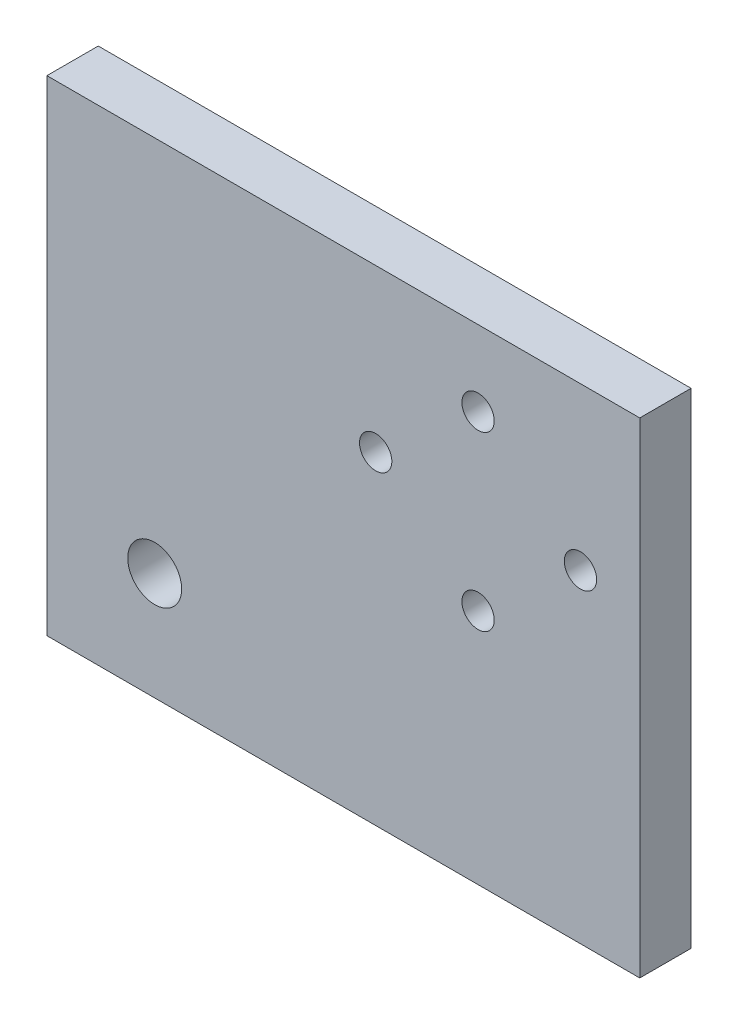
ISO-10303-21;
HEADER;
FILE_DESCRIPTION(('STEP AP214'),'2;1');
FILE_NAME('part.step','',(''),(''),'','','');
FILE_SCHEMA(('AUTOMOTIVE_DESIGN { 1 0 10303 214 1 1 1 1 }'));
ENDSEC;
DATA;
#1=APPLICATION_CONTEXT('core data for automotive mechanical design processes');
#2=APPLICATION_PROTOCOL_DEFINITION('international standard','automotive_design',2000,#1);
#3=PRODUCT_CONTEXT('',#1,'mechanical');
#4=PRODUCT('Part','Part','',(#3));
#5=PRODUCT_RELATED_PRODUCT_CATEGORY('part','',(#4));
#6=PRODUCT_DEFINITION_FORMATION('','',#4);
#7=PRODUCT_DEFINITION_CONTEXT('part definition',#1,'design');
#8=PRODUCT_DEFINITION('design','',#6,#7);
#9=PRODUCT_DEFINITION_SHAPE('','',#8);
#10=(LENGTH_UNIT() NAMED_UNIT(*) SI_UNIT(.MILLI.,.METRE.));
#11=(NAMED_UNIT(*) PLANE_ANGLE_UNIT() SI_UNIT($,.RADIAN.));
#12=(NAMED_UNIT(*) SI_UNIT($,.STERADIAN.) SOLID_ANGLE_UNIT());
#13=UNCERTAINTY_MEASURE_WITH_UNIT(LENGTH_MEASURE(1.E-05),#10,'distance_accuracy_value','');
#14=(GEOMETRIC_REPRESENTATION_CONTEXT(3) GLOBAL_UNCERTAINTY_ASSIGNED_CONTEXT((#13)) GLOBAL_UNIT_ASSIGNED_CONTEXT((#10,
#11,#12)) REPRESENTATION_CONTEXT('',''));
#15=CARTESIAN_POINT('',(0.,0.,0.));
#16=DIRECTION('',(0.,0.,1.));
#17=DIRECTION('',(1.,0.,0.));
#18=AXIS2_PLACEMENT_3D('',#15,#16,#17);
#19=CARTESIAN_POINT('',(0.,0.,4.7625));
#20=DIRECTION('',(0.,0.,-1.));
#21=DIRECTION('',(-1.,0.,0.));
#22=AXIS2_PLACEMENT_3D('',#19,#20,#21);
#23=PLANE('',#22);
#24=CARTESIAN_POINT('',(40.,38.,4.7625));
#25=DIRECTION('',(0.,0.,1.));
#26=DIRECTION('',(1.,0.,0.));
#27=AXIS2_PLACEMENT_3D('',#24,#25,#26);
#28=CIRCLE('',#27,1.5);
#29=CARTESIAN_POINT('',(38.5,38.,4.7625));
#30=VERTEX_POINT('',#29);
#31=EDGE_CURVE('E127',#30,#30,#28,.T.);
#32=ORIENTED_EDGE('',*,*,#31,.F.);
#33=EDGE_LOOP('',(#32));
#34=FACE_BOUND('',#33,.T.);
#35=CARTESIAN_POINT('',(30.5,30.,4.7625));
#36=DIRECTION('',(0.,0.,1.));
#37=DIRECTION('',(1.,0.,0.));
#38=AXIS2_PLACEMENT_3D('',#35,#36,#37);
#39=CIRCLE('',#38,1.50000000000001);
#40=CARTESIAN_POINT('',(29.,30.,4.7625));
#41=VERTEX_POINT('',#40);
#42=EDGE_CURVE('E115',#41,#41,#39,.T.);
#43=ORIENTED_EDGE('',*,*,#42,.F.);
#44=EDGE_LOOP('',(#43));
#45=FACE_BOUND('',#44,.T.);
#46=DIRECTION('',(0.,-1.,0.));
#47=VECTOR('',#46,1.);
#48=CARTESIAN_POINT('',(0.,0.,4.7625));
#49=LINE('',#48,#47);
#50=CARTESIAN_POINT('',(0.,45.,4.7625));
#51=VERTEX_POINT('',#50);
#52=CARTESIAN_POINT('',(0.,0.,4.7625));
#53=VERTEX_POINT('',#52);
#54=EDGE_CURVE('E85',#51,#53,#49,.T.);
#55=ORIENTED_EDGE('',*,*,#54,.T.);
#56=DIRECTION('',(1.,0.,0.));
#57=VECTOR('',#56,1.);
#58=CARTESIAN_POINT('',(0.,0.,4.7625));
#59=LINE('',#58,#57);
#60=CARTESIAN_POINT('',(55.,0.,4.7625));
#61=VERTEX_POINT('',#60);
#62=EDGE_CURVE('E80',#53,#61,#59,.T.);
#63=ORIENTED_EDGE('',*,*,#62,.T.);
#64=DIRECTION('',(0.,1.,0.));
#65=VECTOR('',#64,1.);
#66=CARTESIAN_POINT('',(55.,0.,4.7625));
#67=LINE('',#66,#65);
#68=CARTESIAN_POINT('',(55.,45.,4.7625));
#69=VERTEX_POINT('',#68);
#70=EDGE_CURVE('E83',#61,#69,#67,.T.);
#71=ORIENTED_EDGE('',*,*,#70,.T.);
#72=DIRECTION('',(-1.,0.,0.));
#73=VECTOR('',#72,1.);
#74=CARTESIAN_POINT('',(0.,45.,4.7625));
#75=LINE('',#74,#73);
#76=EDGE_CURVE('E50',#69,#51,#75,.T.);
#77=ORIENTED_EDGE('',*,*,#76,.T.);
#78=EDGE_LOOP('',(#55,#63,#71,#77));
#79=FACE_BOUND('',#78,.T.);
#80=CARTESIAN_POINT('',(10.,10.,4.7625));
#81=DIRECTION('',(0.,0.,1.));
#82=DIRECTION('',(1.,0.,0.));
#83=AXIS2_PLACEMENT_3D('',#80,#81,#82);
#84=CIRCLE('',#83,2.5);
#85=CARTESIAN_POINT('',(7.5,10.,4.7625));
#86=VERTEX_POINT('',#85);
#87=EDGE_CURVE('E100',#86,#86,#84,.T.);
#88=ORIENTED_EDGE('',*,*,#87,.F.);
#89=EDGE_LOOP('',(#88));
#90=FACE_BOUND('',#89,.T.);
#91=CARTESIAN_POINT('',(49.5,30.,4.7625));
#92=DIRECTION('',(0.,0.,1.));
#93=DIRECTION('',(1.,0.,0.));
#94=AXIS2_PLACEMENT_3D('',#91,#92,#93);
#95=CIRCLE('',#94,1.5);
#96=CARTESIAN_POINT('',(48.,30.,4.7625));
#97=VERTEX_POINT('',#96);
#98=EDGE_CURVE('E121',#97,#97,#95,.T.);
#99=ORIENTED_EDGE('',*,*,#98,.F.);
#100=EDGE_LOOP('',(#99));
#101=FACE_BOUND('',#100,.T.);
#102=CARTESIAN_POINT('',(40.,22.,4.7625));
#103=DIRECTION('',(0.,0.,1.));
#104=DIRECTION('',(1.,0.,0.));
#105=AXIS2_PLACEMENT_3D('',#102,#103,#104);
#106=CIRCLE('',#105,1.5);
#107=CARTESIAN_POINT('',(38.5,22.,4.7625));
#108=VERTEX_POINT('',#107);
#109=EDGE_CURVE('E133',#108,#108,#106,.T.);
#110=ORIENTED_EDGE('',*,*,#109,.F.);
#111=EDGE_LOOP('',(#110));
#112=FACE_BOUND('',#111,.T.);
#113=ADVANCED_FACE('F33',(#34,#45,#79,#90,#101,#112),#23,.F.);
#114=CARTESIAN_POINT('',(0.,0.,0.));
#115=DIRECTION('',(0.,0.,-1.));
#116=DIRECTION('',(-1.,0.,0.));
#117=AXIS2_PLACEMENT_3D('',#114,#115,#116);
#118=PLANE('',#117);
#119=CARTESIAN_POINT('',(40.,38.,0.));
#120=DIRECTION('',(0.,0.,1.));
#121=DIRECTION('',(1.,0.,0.));
#122=AXIS2_PLACEMENT_3D('',#119,#120,#121);
#123=CIRCLE('',#122,1.5);
#124=CARTESIAN_POINT('',(38.5,38.,0.));
#125=VERTEX_POINT('',#124);
#126=EDGE_CURVE('E130',#125,#125,#123,.T.);
#127=ORIENTED_EDGE('',*,*,#126,.T.);
#128=EDGE_LOOP('',(#127));
#129=FACE_BOUND('',#128,.T.);
#130=CARTESIAN_POINT('',(30.5,30.,0.));
#131=DIRECTION('',(0.,0.,1.));
#132=DIRECTION('',(1.,0.,0.));
#133=AXIS2_PLACEMENT_3D('',#130,#131,#132);
#134=CIRCLE('',#133,1.50000000000001);
#135=CARTESIAN_POINT('',(29.,30.,0.));
#136=VERTEX_POINT('',#135);
#137=EDGE_CURVE('E118',#136,#136,#134,.T.);
#138=ORIENTED_EDGE('',*,*,#137,.T.);
#139=EDGE_LOOP('',(#138));
#140=FACE_BOUND('',#139,.T.);
#141=DIRECTION('',(0.,-1.,0.));
#142=VECTOR('',#141,1.);
#143=CARTESIAN_POINT('',(0.,0.,0.));
#144=LINE('',#143,#142);
#145=CARTESIAN_POINT('',(0.,45.,0.));
#146=VERTEX_POINT('',#145);
#147=CARTESIAN_POINT('',(0.,0.,0.));
#148=VERTEX_POINT('',#147);
#149=EDGE_CURVE('E97',#146,#148,#144,.T.);
#150=ORIENTED_EDGE('',*,*,#149,.F.);
#151=DIRECTION('',(-1.,0.,0.));
#152=VECTOR('',#151,1.);
#153=CARTESIAN_POINT('',(0.,45.,0.));
#154=LINE('',#153,#152);
#155=CARTESIAN_POINT('',(55.,45.,0.));
#156=VERTEX_POINT('',#155);
#157=EDGE_CURVE('E73',#156,#146,#154,.T.);
#158=ORIENTED_EDGE('',*,*,#157,.F.);
#159=DIRECTION('',(0.,1.,0.));
#160=VECTOR('',#159,1.);
#161=CARTESIAN_POINT('',(55.,0.,0.));
#162=LINE('',#161,#160);
#163=CARTESIAN_POINT('',(55.,0.,0.));
#164=VERTEX_POINT('',#163);
#165=EDGE_CURVE('E67',#164,#156,#162,.T.);
#166=ORIENTED_EDGE('',*,*,#165,.F.);
#167=DIRECTION('',(1.,0.,0.));
#168=VECTOR('',#167,1.);
#169=CARTESIAN_POINT('',(0.,0.,0.));
#170=LINE('',#169,#168);
#171=EDGE_CURVE('E89',#148,#164,#170,.T.);
#172=ORIENTED_EDGE('',*,*,#171,.F.);
#173=EDGE_LOOP('',(#150,#158,#166,#172));
#174=FACE_BOUND('',#173,.T.);
#175=CARTESIAN_POINT('',(10.,10.,0.));
#176=DIRECTION('',(0.,0.,1.));
#177=DIRECTION('',(1.,0.,0.));
#178=AXIS2_PLACEMENT_3D('',#175,#176,#177);
#179=CIRCLE('',#178,2.5);
#180=CARTESIAN_POINT('',(7.5,10.,0.));
#181=VERTEX_POINT('',#180);
#182=EDGE_CURVE('E112',#181,#181,#179,.T.);
#183=ORIENTED_EDGE('',*,*,#182,.T.);
#184=EDGE_LOOP('',(#183));
#185=FACE_BOUND('',#184,.T.);
#186=CARTESIAN_POINT('',(49.5,30.,0.));
#187=DIRECTION('',(0.,0.,1.));
#188=DIRECTION('',(1.,0.,0.));
#189=AXIS2_PLACEMENT_3D('',#186,#187,#188);
#190=CIRCLE('',#189,1.5);
#191=CARTESIAN_POINT('',(48.,30.,0.));
#192=VERTEX_POINT('',#191);
#193=EDGE_CURVE('E124',#192,#192,#190,.T.);
#194=ORIENTED_EDGE('',*,*,#193,.T.);
#195=EDGE_LOOP('',(#194));
#196=FACE_BOUND('',#195,.T.);
#197=CARTESIAN_POINT('',(40.,22.,0.));
#198=DIRECTION('',(0.,0.,1.));
#199=DIRECTION('',(1.,0.,0.));
#200=AXIS2_PLACEMENT_3D('',#197,#198,#199);
#201=CIRCLE('',#200,1.5);
#202=CARTESIAN_POINT('',(38.5,22.,0.));
#203=VERTEX_POINT('',#202);
#204=EDGE_CURVE('E136',#203,#203,#201,.T.);
#205=ORIENTED_EDGE('',*,*,#204,.T.);
#206=EDGE_LOOP('',(#205));
#207=FACE_BOUND('',#206,.T.);
#208=ADVANCED_FACE('F108',(#129,#140,#174,#185,#196,#207),#118,.T.);
#209=CARTESIAN_POINT('',(0.,0.,4.7625));
#210=DIRECTION('',(1.,0.,0.));
#211=DIRECTION('',(0.,0.,-1.));
#212=AXIS2_PLACEMENT_3D('',#209,#210,#211);
#213=PLANE('',#212);
#214=ORIENTED_EDGE('',*,*,#149,.T.);
#215=DIRECTION('',(0.,0.,-1.));
#216=VECTOR('',#215,1.);
#217=CARTESIAN_POINT('',(0.,0.,4.7625));
#218=LINE('',#217,#216);
#219=EDGE_CURVE('E11',#53,#148,#218,.T.);
#220=ORIENTED_EDGE('',*,*,#219,.F.);
#221=ORIENTED_EDGE('',*,*,#54,.F.);
#222=DIRECTION('',(0.,0.,-1.));
#223=VECTOR('',#222,1.);
#224=CARTESIAN_POINT('',(0.,45.,4.7625));
#225=LINE('',#224,#223);
#226=EDGE_CURVE('E93',#51,#146,#225,.T.);
#227=ORIENTED_EDGE('',*,*,#226,.T.);
#228=EDGE_LOOP('',(#214,#220,#221,#227));
#229=FACE_BOUND('',#228,.T.);
#230=ADVANCED_FACE('F35',(#229),#213,.F.);
#231=CARTESIAN_POINT('',(0.,0.,4.7625));
#232=DIRECTION('',(0.,1.,0.));
#233=DIRECTION('',(0.,0.,1.));
#234=AXIS2_PLACEMENT_3D('',#231,#232,#233);
#235=PLANE('',#234);
#236=ORIENTED_EDGE('',*,*,#171,.T.);
#237=DIRECTION('',(0.,0.,-1.));
#238=VECTOR('',#237,1.);
#239=CARTESIAN_POINT('',(55.,0.,4.7625));
#240=LINE('',#239,#238);
#241=EDGE_CURVE('E42',#61,#164,#240,.T.);
#242=ORIENTED_EDGE('',*,*,#241,.F.);
#243=ORIENTED_EDGE('',*,*,#62,.F.);
#244=ORIENTED_EDGE('',*,*,#219,.T.);
#245=EDGE_LOOP('',(#236,#242,#243,#244));
#246=FACE_BOUND('',#245,.T.);
#247=ADVANCED_FACE('F88',(#246),#235,.F.);
#248=CARTESIAN_POINT('',(55.,0.,4.7625));
#249=DIRECTION('',(-1.,0.,0.));
#250=DIRECTION('',(0.,0.,1.));
#251=AXIS2_PLACEMENT_3D('',#248,#249,#250);
#252=PLANE('',#251);
#253=ORIENTED_EDGE('',*,*,#165,.T.);
#254=DIRECTION('',(0.,0.,-1.));
#255=VECTOR('',#254,1.);
#256=CARTESIAN_POINT('',(55.,45.,4.7625));
#257=LINE('',#256,#255);
#258=EDGE_CURVE('E90',#69,#156,#257,.T.);
#259=ORIENTED_EDGE('',*,*,#258,.F.);
#260=ORIENTED_EDGE('',*,*,#70,.F.);
#261=ORIENTED_EDGE('',*,*,#241,.T.);
#262=EDGE_LOOP('',(#253,#259,#260,#261));
#263=FACE_BOUND('',#262,.T.);
#264=ADVANCED_FACE('F91',(#263),#252,.F.);
#265=CARTESIAN_POINT('',(0.,45.,4.7625));
#266=DIRECTION('',(0.,-1.,0.));
#267=DIRECTION('',(0.,0.,-1.));
#268=AXIS2_PLACEMENT_3D('',#265,#266,#267);
#269=PLANE('',#268);
#270=ORIENTED_EDGE('',*,*,#157,.T.);
#271=ORIENTED_EDGE('',*,*,#226,.F.);
#272=ORIENTED_EDGE('',*,*,#76,.F.);
#273=ORIENTED_EDGE('',*,*,#258,.T.);
#274=EDGE_LOOP('',(#270,#271,#272,#273));
#275=FACE_BOUND('',#274,.T.);
#276=ADVANCED_FACE('F105',(#275),#269,.F.);
#277=CARTESIAN_POINT('',(10.,10.,4.7625));
#278=DIRECTION('',(0.,0.,-1.));
#279=DIRECTION('',(-1.,0.,0.));
#280=AXIS2_PLACEMENT_3D('',#277,#278,#279);
#281=CYLINDRICAL_SURFACE('',#280,2.5);
#282=CARTESIAN_POINT('',(7.5,10.,4.7625));
#283=CARTESIAN_POINT('',(7.5,10.,4.712890625));
#284=CARTESIAN_POINT('',(7.5,10.,4.66328125));
#285=CARTESIAN_POINT('',(7.5,10.,4.5640625));
#286=CARTESIAN_POINT('',(7.5,10.,4.514453125));
#287=CARTESIAN_POINT('',(7.5,10.,4.415234375));
#288=CARTESIAN_POINT('',(7.5,10.,4.365625));
#289=CARTESIAN_POINT('',(7.5,10.,4.26640625));
#290=CARTESIAN_POINT('',(7.5,10.,4.216796875));
#291=CARTESIAN_POINT('',(7.5,10.,4.117578125));
#292=CARTESIAN_POINT('',(7.5,10.,4.06796875));
#293=CARTESIAN_POINT('',(7.5,10.,3.96875));
#294=CARTESIAN_POINT('',(7.5,10.,3.919140625));
#295=CARTESIAN_POINT('',(7.5,10.,3.819921875));
#296=CARTESIAN_POINT('',(7.5,10.,3.7703125));
#297=CARTESIAN_POINT('',(7.5,10.,3.67109375));
#298=CARTESIAN_POINT('',(7.5,10.,3.621484375));
#299=CARTESIAN_POINT('',(7.5,10.,3.522265625));
#300=CARTESIAN_POINT('',(7.5,10.,3.47265625));
#301=CARTESIAN_POINT('',(7.5,10.,3.3734375));
#302=CARTESIAN_POINT('',(7.5,10.,3.323828125));
#303=CARTESIAN_POINT('',(7.5,10.,3.224609375));
#304=CARTESIAN_POINT('',(7.5,10.,3.175));
#305=CARTESIAN_POINT('',(7.5,10.,3.07578125));
#306=CARTESIAN_POINT('',(7.5,10.,3.026171875));
#307=CARTESIAN_POINT('',(7.5,10.,2.926953125));
#308=CARTESIAN_POINT('',(7.5,10.,2.87734375));
#309=CARTESIAN_POINT('',(7.5,10.,2.778125));
#310=CARTESIAN_POINT('',(7.5,10.,2.728515625));
#311=CARTESIAN_POINT('',(7.5,10.,2.629296875));
#312=CARTESIAN_POINT('',(7.5,10.,2.5796875));
#313=CARTESIAN_POINT('',(7.5,10.,2.48046875));
#314=CARTESIAN_POINT('',(7.5,10.,2.430859375));
#315=CARTESIAN_POINT('',(7.5,10.,2.331640625));
#316=CARTESIAN_POINT('',(7.5,10.,2.28203125));
#317=CARTESIAN_POINT('',(7.5,10.,2.1828125));
#318=CARTESIAN_POINT('',(7.5,10.,2.133203125));
#319=CARTESIAN_POINT('',(7.5,10.,2.033984375));
#320=CARTESIAN_POINT('',(7.5,10.,1.984375));
#321=CARTESIAN_POINT('',(7.5,10.,1.88515625));
#322=CARTESIAN_POINT('',(7.5,10.,1.835546875));
#323=CARTESIAN_POINT('',(7.5,10.,1.736328125));
#324=CARTESIAN_POINT('',(7.5,10.,1.68671875));
#325=CARTESIAN_POINT('',(7.5,10.,1.5875));
#326=CARTESIAN_POINT('',(7.5,10.,1.537890625));
#327=CARTESIAN_POINT('',(7.5,10.,1.438671875));
#328=CARTESIAN_POINT('',(7.5,10.,1.3890625));
#329=CARTESIAN_POINT('',(7.5,10.,1.28984375));
#330=CARTESIAN_POINT('',(7.5,10.,1.240234375));
#331=CARTESIAN_POINT('',(7.5,10.,1.141015625));
#332=CARTESIAN_POINT('',(7.5,10.,1.09140625));
#333=CARTESIAN_POINT('',(7.5,10.,0.992187499999999));
#334=CARTESIAN_POINT('',(7.5,10.,0.942578124999999));
#335=CARTESIAN_POINT('',(7.5,10.,0.843359375));
#336=CARTESIAN_POINT('',(7.5,10.,0.79375));
#337=CARTESIAN_POINT('',(7.5,10.,0.69453125));
#338=CARTESIAN_POINT('',(7.5,10.,0.644921875));
#339=CARTESIAN_POINT('',(7.5,10.,0.545703125));
#340=CARTESIAN_POINT('',(7.5,10.,0.49609375));
#341=CARTESIAN_POINT('',(7.5,10.,0.396875));
#342=CARTESIAN_POINT('',(7.5,10.,0.347265625));
#343=CARTESIAN_POINT('',(7.5,10.,0.248046875));
#344=CARTESIAN_POINT('',(7.5,10.,0.1984375));
#345=CARTESIAN_POINT('',(7.5,10.,0.09921875));
#346=CARTESIAN_POINT('',(7.5,10.,0.049609375));
#347=CARTESIAN_POINT('',(7.5,10.,0.));
#348=B_SPLINE_CURVE_WITH_KNOTS('',3,(#282,#283,#284,#285,#286,#287,#288,#289,#290,#291,#292,
#293,#294,#295,#296,#297,#298,#299,#300,#301,#302,#303,#304,#305,#306,#307,#308,#309,#310,#311,
#312,#313,#314,#315,#316,#317,#318,#319,#320,#321,#322,#323,#324,#325,#326,#327,#328,#329,#330,
#331,#332,#333,#334,#335,#336,#337,#338,#339,#340,#341,#342,#343,#344,#345,#346,#347),
.UNSPECIFIED.,.F.,.F.,(4,2,2,2,2,2,2,2,2,2,2,2,2,2,2,2,2,2,2,2,2,2,2,2,2,2,2,2,2,2,2,2,4),(0.,
0.148828125,0.29765625,0.446484375,0.5953125,0.744140625,0.892968750000001,1.041796875,1.190625,
1.339453125,1.48828125,1.637109375,1.7859375,1.934765625,2.08359375,2.232421875,2.38125,
2.530078125,2.67890625,2.827734375,2.9765625,3.125390625,3.27421875,3.423046875,3.571875,
3.720703125,3.86953125,4.018359375,4.1671875,4.316015625,4.46484375,4.613671875,4.7625),.UNSPECIFIED.);
#349=EDGE_CURVE('BSEAM156',#86,#181,#348,.T.);
#350=ORIENTED_EDGE('',*,*,#87,.T.);
#351=ORIENTED_EDGE('',*,*,#182,.F.);
#352=ORIENTED_EDGE('',*,*,#349,.T.);
#353=ORIENTED_EDGE('',*,*,#349,.F.);
#354=EDGE_LOOP('',(#350,#352,#351,#353));
#355=FACE_BOUND('',#354,.T.);
#356=ADVANCED_FACE('F156',(#355),#281,.F.);
#357=CARTESIAN_POINT('',(30.5,30.,4.7625));
#358=DIRECTION('',(0.,0.,-1.));
#359=DIRECTION('',(-1.,0.,0.));
#360=AXIS2_PLACEMENT_3D('',#357,#358,#359);
#361=CYLINDRICAL_SURFACE('',#360,1.50000000000001);
#362=CARTESIAN_POINT('',(29.,30.,4.7625));
#363=CARTESIAN_POINT('',(29.,30.,4.712890625));
#364=CARTESIAN_POINT('',(29.,30.,4.66328125));
#365=CARTESIAN_POINT('',(29.,30.,4.5640625));
#366=CARTESIAN_POINT('',(29.,30.,4.514453125));
#367=CARTESIAN_POINT('',(29.,30.,4.415234375));
#368=CARTESIAN_POINT('',(29.,30.,4.365625));
#369=CARTESIAN_POINT('',(29.,30.,4.26640625));
#370=CARTESIAN_POINT('',(29.,30.,4.216796875));
#371=CARTESIAN_POINT('',(29.,30.,4.117578125));
#372=CARTESIAN_POINT('',(29.,30.,4.06796875));
#373=CARTESIAN_POINT('',(29.,30.,3.96875));
#374=CARTESIAN_POINT('',(29.,30.,3.919140625));
#375=CARTESIAN_POINT('',(29.,30.,3.819921875));
#376=CARTESIAN_POINT('',(29.,30.,3.7703125));
#377=CARTESIAN_POINT('',(29.,30.,3.67109375));
#378=CARTESIAN_POINT('',(29.,30.,3.621484375));
#379=CARTESIAN_POINT('',(29.,30.,3.522265625));
#380=CARTESIAN_POINT('',(29.,30.,3.47265625));
#381=CARTESIAN_POINT('',(29.,30.,3.3734375));
#382=CARTESIAN_POINT('',(29.,30.,3.323828125));
#383=CARTESIAN_POINT('',(29.,30.,3.224609375));
#384=CARTESIAN_POINT('',(29.,30.,3.175));
#385=CARTESIAN_POINT('',(29.,30.,3.07578125));
#386=CARTESIAN_POINT('',(29.,30.,3.026171875));
#387=CARTESIAN_POINT('',(29.,30.,2.926953125));
#388=CARTESIAN_POINT('',(29.,30.,2.87734375));
#389=CARTESIAN_POINT('',(29.,30.,2.778125));
#390=CARTESIAN_POINT('',(29.,30.,2.728515625));
#391=CARTESIAN_POINT('',(29.,30.,2.629296875));
#392=CARTESIAN_POINT('',(29.,30.,2.5796875));
#393=CARTESIAN_POINT('',(29.,30.,2.48046875));
#394=CARTESIAN_POINT('',(29.,30.,2.430859375));
#395=CARTESIAN_POINT('',(29.,30.,2.331640625));
#396=CARTESIAN_POINT('',(29.,30.,2.28203125));
#397=CARTESIAN_POINT('',(29.,30.,2.1828125));
#398=CARTESIAN_POINT('',(29.,30.,2.133203125));
#399=CARTESIAN_POINT('',(29.,30.,2.033984375));
#400=CARTESIAN_POINT('',(29.,30.,1.984375));
#401=CARTESIAN_POINT('',(29.,30.,1.88515625));
#402=CARTESIAN_POINT('',(29.,30.,1.835546875));
#403=CARTESIAN_POINT('',(29.,30.,1.736328125));
#404=CARTESIAN_POINT('',(29.,30.,1.68671875));
#405=CARTESIAN_POINT('',(29.,30.,1.5875));
#406=CARTESIAN_POINT('',(29.,30.,1.537890625));
#407=CARTESIAN_POINT('',(29.,30.,1.438671875));
#408=CARTESIAN_POINT('',(29.,30.,1.3890625));
#409=CARTESIAN_POINT('',(29.,30.,1.28984375));
#410=CARTESIAN_POINT('',(29.,30.,1.240234375));
#411=CARTESIAN_POINT('',(29.,30.,1.141015625));
#412=CARTESIAN_POINT('',(29.,30.,1.09140625));
#413=CARTESIAN_POINT('',(29.,30.,0.9921875));
#414=CARTESIAN_POINT('',(29.,30.,0.942578125));
#415=CARTESIAN_POINT('',(29.,30.,0.843359375));
#416=CARTESIAN_POINT('',(29.,30.,0.79375));
#417=CARTESIAN_POINT('',(29.,30.,0.69453125));
#418=CARTESIAN_POINT('',(29.,30.,0.644921875));
#419=CARTESIAN_POINT('',(29.,30.,0.545703125));
#420=CARTESIAN_POINT('',(29.,30.,0.49609375));
#421=CARTESIAN_POINT('',(29.,30.,0.396875));
#422=CARTESIAN_POINT('',(29.,30.,0.347265625));
#423=CARTESIAN_POINT('',(29.,30.,0.248046875));
#424=CARTESIAN_POINT('',(29.,30.,0.1984375));
#425=CARTESIAN_POINT('',(29.,30.,0.09921875));
#426=CARTESIAN_POINT('',(29.,30.,0.049609375));
#427=CARTESIAN_POINT('',(29.,30.,0.));
#428=B_SPLINE_CURVE_WITH_KNOTS('',3,(#362,#363,#364,#365,#366,#367,#368,#369,#370,#371,#372,
#373,#374,#375,#376,#377,#378,#379,#380,#381,#382,#383,#384,#385,#386,#387,#388,#389,#390,#391,
#392,#393,#394,#395,#396,#397,#398,#399,#400,#401,#402,#403,#404,#405,#406,#407,#408,#409,#410,
#411,#412,#413,#414,#415,#416,#417,#418,#419,#420,#421,#422,#423,#424,#425,#426,#427),
.UNSPECIFIED.,.F.,.F.,(4,2,2,2,2,2,2,2,2,2,2,2,2,2,2,2,2,2,2,2,2,2,2,2,2,2,2,2,2,2,2,2,4),(0.,
0.148828124999999,0.297656249999999,0.446484374999999,0.595312499999999,0.744140625,0.89296875,
1.041796875,1.190625,1.339453125,1.48828125,1.637109375,1.7859375,1.934765625,2.08359375,
2.232421875,2.38125,2.530078125,2.67890625,2.827734375,2.9765625,3.125390625,3.27421875,
3.423046875,3.571875,3.720703125,3.86953125,4.018359375,4.1671875,4.316015625,4.46484375,
4.613671875,4.7625),.UNSPECIFIED.);
#429=EDGE_CURVE('BSEAM202',#41,#136,#428,.T.);
#430=ORIENTED_EDGE('',*,*,#42,.T.);
#431=ORIENTED_EDGE('',*,*,#137,.F.);
#432=ORIENTED_EDGE('',*,*,#429,.T.);
#433=ORIENTED_EDGE('',*,*,#429,.F.);
#434=EDGE_LOOP('',(#430,#432,#431,#433));
#435=FACE_BOUND('',#434,.T.);
#436=ADVANCED_FACE('F202',(#435),#361,.F.);
#437=CARTESIAN_POINT('',(49.5,30.,4.7625));
#438=DIRECTION('',(0.,0.,-1.));
#439=DIRECTION('',(-1.,0.,0.));
#440=AXIS2_PLACEMENT_3D('',#437,#438,#439);
#441=CYLINDRICAL_SURFACE('',#440,1.5);
#442=CARTESIAN_POINT('',(48.,30.,4.7625));
#443=CARTESIAN_POINT('',(48.,30.,4.712890625));
#444=CARTESIAN_POINT('',(48.,30.,4.66328125));
#445=CARTESIAN_POINT('',(48.,30.,4.5640625));
#446=CARTESIAN_POINT('',(48.,30.,4.514453125));
#447=CARTESIAN_POINT('',(48.,30.,4.415234375));
#448=CARTESIAN_POINT('',(48.,30.,4.365625));
#449=CARTESIAN_POINT('',(48.,30.,4.26640625));
#450=CARTESIAN_POINT('',(48.,30.,4.216796875));
#451=CARTESIAN_POINT('',(48.,30.,4.117578125));
#452=CARTESIAN_POINT('',(48.,30.,4.06796875));
#453=CARTESIAN_POINT('',(48.,30.,3.96875));
#454=CARTESIAN_POINT('',(48.,30.,3.919140625));
#455=CARTESIAN_POINT('',(48.,30.,3.819921875));
#456=CARTESIAN_POINT('',(48.,30.,3.7703125));
#457=CARTESIAN_POINT('',(48.,30.,3.67109375));
#458=CARTESIAN_POINT('',(48.,30.,3.621484375));
#459=CARTESIAN_POINT('',(48.,30.,3.522265625));
#460=CARTESIAN_POINT('',(48.,30.,3.47265625));
#461=CARTESIAN_POINT('',(48.,30.,3.3734375));
#462=CARTESIAN_POINT('',(48.,30.,3.323828125));
#463=CARTESIAN_POINT('',(48.,30.,3.224609375));
#464=CARTESIAN_POINT('',(48.,30.,3.175));
#465=CARTESIAN_POINT('',(48.,30.,3.07578125));
#466=CARTESIAN_POINT('',(48.,30.,3.026171875));
#467=CARTESIAN_POINT('',(48.,30.,2.926953125));
#468=CARTESIAN_POINT('',(48.,30.,2.87734375));
#469=CARTESIAN_POINT('',(48.,30.,2.778125));
#470=CARTESIAN_POINT('',(48.,30.,2.728515625));
#471=CARTESIAN_POINT('',(48.,30.,2.629296875));
#472=CARTESIAN_POINT('',(48.,30.,2.5796875));
#473=CARTESIAN_POINT('',(48.,30.,2.48046875));
#474=CARTESIAN_POINT('',(48.,30.,2.430859375));
#475=CARTESIAN_POINT('',(48.,30.,2.331640625));
#476=CARTESIAN_POINT('',(48.,30.,2.28203125));
#477=CARTESIAN_POINT('',(48.,30.,2.1828125));
#478=CARTESIAN_POINT('',(48.,30.,2.133203125));
#479=CARTESIAN_POINT('',(48.,30.,2.033984375));
#480=CARTESIAN_POINT('',(48.,30.,1.984375));
#481=CARTESIAN_POINT('',(48.,30.,1.88515625));
#482=CARTESIAN_POINT('',(48.,30.,1.835546875));
#483=CARTESIAN_POINT('',(48.,30.,1.736328125));
#484=CARTESIAN_POINT('',(48.,30.,1.68671875));
#485=CARTESIAN_POINT('',(48.,30.,1.5875));
#486=CARTESIAN_POINT('',(48.,30.,1.537890625));
#487=CARTESIAN_POINT('',(48.,30.,1.438671875));
#488=CARTESIAN_POINT('',(48.,30.,1.3890625));
#489=CARTESIAN_POINT('',(48.,30.,1.28984375));
#490=CARTESIAN_POINT('',(48.,30.,1.240234375));
#491=CARTESIAN_POINT('',(48.,30.,1.141015625));
#492=CARTESIAN_POINT('',(48.,30.,1.09140625));
#493=CARTESIAN_POINT('',(48.,30.,0.9921875));
#494=CARTESIAN_POINT('',(48.,30.,0.942578125));
#495=CARTESIAN_POINT('',(48.,30.,0.843359375));
#496=CARTESIAN_POINT('',(48.,30.,0.79375));
#497=CARTESIAN_POINT('',(48.,30.,0.69453125));
#498=CARTESIAN_POINT('',(48.,30.,0.644921875));
#499=CARTESIAN_POINT('',(48.,30.,0.545703125));
#500=CARTESIAN_POINT('',(48.,30.,0.49609375));
#501=CARTESIAN_POINT('',(48.,30.,0.396875));
#502=CARTESIAN_POINT('',(48.,30.,0.347265625));
#503=CARTESIAN_POINT('',(48.,30.,0.248046875));
#504=CARTESIAN_POINT('',(48.,30.,0.1984375));
#505=CARTESIAN_POINT('',(48.,30.,0.09921875));
#506=CARTESIAN_POINT('',(48.,30.,0.049609375));
#507=CARTESIAN_POINT('',(48.,30.,0.));
#508=B_SPLINE_CURVE_WITH_KNOTS('',3,(#442,#443,#444,#445,#446,#447,#448,#449,#450,#451,#452,
#453,#454,#455,#456,#457,#458,#459,#460,#461,#462,#463,#464,#465,#466,#467,#468,#469,#470,#471,
#472,#473,#474,#475,#476,#477,#478,#479,#480,#481,#482,#483,#484,#485,#486,#487,#488,#489,#490,
#491,#492,#493,#494,#495,#496,#497,#498,#499,#500,#501,#502,#503,#504,#505,#506,#507),
.UNSPECIFIED.,.F.,.F.,(4,2,2,2,2,2,2,2,2,2,2,2,2,2,2,2,2,2,2,2,2,2,2,2,2,2,2,2,2,2,2,2,4),(0.,
0.148828124999999,0.297656249999999,0.446484374999999,0.595312499999999,0.744140625,0.89296875,
1.041796875,1.190625,1.339453125,1.48828125,1.637109375,1.7859375,1.934765625,2.08359375,
2.232421875,2.38125,2.530078125,2.67890625,2.827734375,2.9765625,3.125390625,3.27421875,
3.423046875,3.571875,3.720703125,3.86953125,4.018359375,4.1671875,4.316015625,4.46484375,
4.613671875,4.7625),.UNSPECIFIED.);
#509=EDGE_CURVE('BSEAM210',#97,#192,#508,.T.);
#510=ORIENTED_EDGE('',*,*,#98,.T.);
#511=ORIENTED_EDGE('',*,*,#193,.F.);
#512=ORIENTED_EDGE('',*,*,#509,.T.);
#513=ORIENTED_EDGE('',*,*,#509,.F.);
#514=EDGE_LOOP('',(#510,#512,#511,#513));
#515=FACE_BOUND('',#514,.T.);
#516=ADVANCED_FACE('F210',(#515),#441,.F.);
#517=CARTESIAN_POINT('',(40.,38.,4.7625));
#518=DIRECTION('',(0.,0.,-1.));
#519=DIRECTION('',(-1.,0.,0.));
#520=AXIS2_PLACEMENT_3D('',#517,#518,#519);
#521=CYLINDRICAL_SURFACE('',#520,1.5);
#522=CARTESIAN_POINT('',(38.5,38.,4.7625));
#523=CARTESIAN_POINT('',(38.5,38.,4.712890625));
#524=CARTESIAN_POINT('',(38.5,38.,4.66328125));
#525=CARTESIAN_POINT('',(38.5,38.,4.5640625));
#526=CARTESIAN_POINT('',(38.5,38.,4.514453125));
#527=CARTESIAN_POINT('',(38.5,38.,4.415234375));
#528=CARTESIAN_POINT('',(38.5,38.,4.365625));
#529=CARTESIAN_POINT('',(38.5,38.,4.26640625));
#530=CARTESIAN_POINT('',(38.5,38.,4.216796875));
#531=CARTESIAN_POINT('',(38.5,38.,4.117578125));
#532=CARTESIAN_POINT('',(38.5,38.,4.06796875));
#533=CARTESIAN_POINT('',(38.5,38.,3.96875));
#534=CARTESIAN_POINT('',(38.5,38.,3.919140625));
#535=CARTESIAN_POINT('',(38.5,38.,3.819921875));
#536=CARTESIAN_POINT('',(38.5,38.,3.7703125));
#537=CARTESIAN_POINT('',(38.5,38.,3.67109375));
#538=CARTESIAN_POINT('',(38.5,38.,3.621484375));
#539=CARTESIAN_POINT('',(38.5,38.,3.522265625));
#540=CARTESIAN_POINT('',(38.5,38.,3.47265625));
#541=CARTESIAN_POINT('',(38.5,38.,3.3734375));
#542=CARTESIAN_POINT('',(38.5,38.,3.323828125));
#543=CARTESIAN_POINT('',(38.5,38.,3.224609375));
#544=CARTESIAN_POINT('',(38.5,38.,3.175));
#545=CARTESIAN_POINT('',(38.5,38.,3.07578125));
#546=CARTESIAN_POINT('',(38.5,38.,3.026171875));
#547=CARTESIAN_POINT('',(38.5,38.,2.926953125));
#548=CARTESIAN_POINT('',(38.5,38.,2.87734375));
#549=CARTESIAN_POINT('',(38.5,38.,2.778125));
#550=CARTESIAN_POINT('',(38.5,38.,2.728515625));
#551=CARTESIAN_POINT('',(38.5,38.,2.629296875));
#552=CARTESIAN_POINT('',(38.5,38.,2.5796875));
#553=CARTESIAN_POINT('',(38.5,38.,2.48046875));
#554=CARTESIAN_POINT('',(38.5,38.,2.430859375));
#555=CARTESIAN_POINT('',(38.5,38.,2.331640625));
#556=CARTESIAN_POINT('',(38.5,38.,2.28203125));
#557=CARTESIAN_POINT('',(38.5,38.,2.1828125));
#558=CARTESIAN_POINT('',(38.5,38.,2.133203125));
#559=CARTESIAN_POINT('',(38.5,38.,2.033984375));
#560=CARTESIAN_POINT('',(38.5,38.,1.984375));
#561=CARTESIAN_POINT('',(38.5,38.,1.88515625));
#562=CARTESIAN_POINT('',(38.5,38.,1.835546875));
#563=CARTESIAN_POINT('',(38.5,38.,1.736328125));
#564=CARTESIAN_POINT('',(38.5,38.,1.68671875));
#565=CARTESIAN_POINT('',(38.5,38.,1.5875));
#566=CARTESIAN_POINT('',(38.5,38.,1.537890625));
#567=CARTESIAN_POINT('',(38.5,38.,1.438671875));
#568=CARTESIAN_POINT('',(38.5,38.,1.3890625));
#569=CARTESIAN_POINT('',(38.5,38.,1.28984375));
#570=CARTESIAN_POINT('',(38.5,38.,1.240234375));
#571=CARTESIAN_POINT('',(38.5,38.,1.141015625));
#572=CARTESIAN_POINT('',(38.5,38.,1.09140625));
#573=CARTESIAN_POINT('',(38.5,38.,0.9921875));
#574=CARTESIAN_POINT('',(38.5,38.,0.942578125));
#575=CARTESIAN_POINT('',(38.5,38.,0.843359375));
#576=CARTESIAN_POINT('',(38.5,38.,0.79375));
#577=CARTESIAN_POINT('',(38.5,38.,0.69453125));
#578=CARTESIAN_POINT('',(38.5,38.,0.644921875));
#579=CARTESIAN_POINT('',(38.5,38.,0.545703125));
#580=CARTESIAN_POINT('',(38.5,38.,0.49609375));
#581=CARTESIAN_POINT('',(38.5,38.,0.396875));
#582=CARTESIAN_POINT('',(38.5,38.,0.347265625));
#583=CARTESIAN_POINT('',(38.5,38.,0.248046875));
#584=CARTESIAN_POINT('',(38.5,38.,0.1984375));
#585=CARTESIAN_POINT('',(38.5,38.,0.09921875));
#586=CARTESIAN_POINT('',(38.5,38.,0.049609375));
#587=CARTESIAN_POINT('',(38.5,38.,0.));
#588=B_SPLINE_CURVE_WITH_KNOTS('',3,(#522,#523,#524,#525,#526,#527,#528,#529,#530,#531,#532,
#533,#534,#535,#536,#537,#538,#539,#540,#541,#542,#543,#544,#545,#546,#547,#548,#549,#550,#551,
#552,#553,#554,#555,#556,#557,#558,#559,#560,#561,#562,#563,#564,#565,#566,#567,#568,#569,#570,
#571,#572,#573,#574,#575,#576,#577,#578,#579,#580,#581,#582,#583,#584,#585,#586,#587),
.UNSPECIFIED.,.F.,.F.,(4,2,2,2,2,2,2,2,2,2,2,2,2,2,2,2,2,2,2,2,2,2,2,2,2,2,2,2,2,2,2,2,4),(0.,
0.148828124999999,0.297656249999999,0.446484374999999,0.595312499999999,0.744140625,0.89296875,
1.041796875,1.190625,1.339453125,1.48828125,1.637109375,1.7859375,1.934765625,2.08359375,
2.232421875,2.38125,2.530078125,2.67890625,2.827734375,2.9765625,3.125390625,3.27421875,
3.423046875,3.571875,3.720703125,3.86953125,4.018359375,4.1671875,4.316015625,4.46484375,
4.613671875,4.7625),.UNSPECIFIED.);
#589=EDGE_CURVE('BSEAM218',#30,#125,#588,.T.);
#590=ORIENTED_EDGE('',*,*,#31,.T.);
#591=ORIENTED_EDGE('',*,*,#126,.F.);
#592=ORIENTED_EDGE('',*,*,#589,.T.);
#593=ORIENTED_EDGE('',*,*,#589,.F.);
#594=EDGE_LOOP('',(#590,#592,#591,#593));
#595=FACE_BOUND('',#594,.T.);
#596=ADVANCED_FACE('F218',(#595),#521,.F.);
#597=CARTESIAN_POINT('',(40.,22.,4.7625));
#598=DIRECTION('',(0.,0.,-1.));
#599=DIRECTION('',(-1.,0.,0.));
#600=AXIS2_PLACEMENT_3D('',#597,#598,#599);
#601=CYLINDRICAL_SURFACE('',#600,1.5);
#602=CARTESIAN_POINT('',(38.5,22.,4.7625));
#603=CARTESIAN_POINT('',(38.5,22.,4.712890625));
#604=CARTESIAN_POINT('',(38.5,22.,4.66328125));
#605=CARTESIAN_POINT('',(38.5,22.,4.5640625));
#606=CARTESIAN_POINT('',(38.5,22.,4.514453125));
#607=CARTESIAN_POINT('',(38.5,22.,4.415234375));
#608=CARTESIAN_POINT('',(38.5,22.,4.365625));
#609=CARTESIAN_POINT('',(38.5,22.,4.26640625));
#610=CARTESIAN_POINT('',(38.5,22.,4.216796875));
#611=CARTESIAN_POINT('',(38.5,22.,4.117578125));
#612=CARTESIAN_POINT('',(38.5,22.,4.06796875));
#613=CARTESIAN_POINT('',(38.5,22.,3.96875));
#614=CARTESIAN_POINT('',(38.5,22.,3.919140625));
#615=CARTESIAN_POINT('',(38.5,22.,3.819921875));
#616=CARTESIAN_POINT('',(38.5,22.,3.7703125));
#617=CARTESIAN_POINT('',(38.5,22.,3.67109375));
#618=CARTESIAN_POINT('',(38.5,22.,3.621484375));
#619=CARTESIAN_POINT('',(38.5,22.,3.522265625));
#620=CARTESIAN_POINT('',(38.5,22.,3.47265625));
#621=CARTESIAN_POINT('',(38.5,22.,3.3734375));
#622=CARTESIAN_POINT('',(38.5,22.,3.323828125));
#623=CARTESIAN_POINT('',(38.5,22.,3.224609375));
#624=CARTESIAN_POINT('',(38.5,22.,3.175));
#625=CARTESIAN_POINT('',(38.5,22.,3.07578125));
#626=CARTESIAN_POINT('',(38.5,22.,3.026171875));
#627=CARTESIAN_POINT('',(38.5,22.,2.926953125));
#628=CARTESIAN_POINT('',(38.5,22.,2.87734375));
#629=CARTESIAN_POINT('',(38.5,22.,2.778125));
#630=CARTESIAN_POINT('',(38.5,22.,2.728515625));
#631=CARTESIAN_POINT('',(38.5,22.,2.629296875));
#632=CARTESIAN_POINT('',(38.5,22.,2.5796875));
#633=CARTESIAN_POINT('',(38.5,22.,2.48046875));
#634=CARTESIAN_POINT('',(38.5,22.,2.430859375));
#635=CARTESIAN_POINT('',(38.5,22.,2.331640625));
#636=CARTESIAN_POINT('',(38.5,22.,2.28203125));
#637=CARTESIAN_POINT('',(38.5,22.,2.1828125));
#638=CARTESIAN_POINT('',(38.5,22.,2.133203125));
#639=CARTESIAN_POINT('',(38.5,22.,2.033984375));
#640=CARTESIAN_POINT('',(38.5,22.,1.984375));
#641=CARTESIAN_POINT('',(38.5,22.,1.88515625));
#642=CARTESIAN_POINT('',(38.5,22.,1.835546875));
#643=CARTESIAN_POINT('',(38.5,22.,1.736328125));
#644=CARTESIAN_POINT('',(38.5,22.,1.68671875));
#645=CARTESIAN_POINT('',(38.5,22.,1.5875));
#646=CARTESIAN_POINT('',(38.5,22.,1.537890625));
#647=CARTESIAN_POINT('',(38.5,22.,1.438671875));
#648=CARTESIAN_POINT('',(38.5,22.,1.3890625));
#649=CARTESIAN_POINT('',(38.5,22.,1.28984375));
#650=CARTESIAN_POINT('',(38.5,22.,1.240234375));
#651=CARTESIAN_POINT('',(38.5,22.,1.141015625));
#652=CARTESIAN_POINT('',(38.5,22.,1.09140625));
#653=CARTESIAN_POINT('',(38.5,22.,0.9921875));
#654=CARTESIAN_POINT('',(38.5,22.,0.942578125));
#655=CARTESIAN_POINT('',(38.5,22.,0.843359375));
#656=CARTESIAN_POINT('',(38.5,22.,0.79375));
#657=CARTESIAN_POINT('',(38.5,22.,0.69453125));
#658=CARTESIAN_POINT('',(38.5,22.,0.644921875));
#659=CARTESIAN_POINT('',(38.5,22.,0.545703125));
#660=CARTESIAN_POINT('',(38.5,22.,0.49609375));
#661=CARTESIAN_POINT('',(38.5,22.,0.396875));
#662=CARTESIAN_POINT('',(38.5,22.,0.347265625));
#663=CARTESIAN_POINT('',(38.5,22.,0.248046875));
#664=CARTESIAN_POINT('',(38.5,22.,0.1984375));
#665=CARTESIAN_POINT('',(38.5,22.,0.09921875));
#666=CARTESIAN_POINT('',(38.5,22.,0.049609375));
#667=CARTESIAN_POINT('',(38.5,22.,0.));
#668=B_SPLINE_CURVE_WITH_KNOTS('',3,(#602,#603,#604,#605,#606,#607,#608,#609,#610,#611,#612,
#613,#614,#615,#616,#617,#618,#619,#620,#621,#622,#623,#624,#625,#626,#627,#628,#629,#630,#631,
#632,#633,#634,#635,#636,#637,#638,#639,#640,#641,#642,#643,#644,#645,#646,#647,#648,#649,#650,
#651,#652,#653,#654,#655,#656,#657,#658,#659,#660,#661,#662,#663,#664,#665,#666,#667),
.UNSPECIFIED.,.F.,.F.,(4,2,2,2,2,2,2,2,2,2,2,2,2,2,2,2,2,2,2,2,2,2,2,2,2,2,2,2,2,2,2,2,4),(0.,
0.148828124999999,0.297656249999999,0.446484374999999,0.595312499999999,0.744140625,0.89296875,
1.041796875,1.190625,1.339453125,1.48828125,1.637109375,1.7859375,1.934765625,2.08359375,
2.232421875,2.38125,2.530078125,2.67890625,2.827734375,2.9765625,3.125390625,3.27421875,
3.423046875,3.571875,3.720703125,3.86953125,4.018359375,4.1671875,4.316015625,4.46484375,
4.613671875,4.7625),.UNSPECIFIED.);
#669=EDGE_CURVE('BSEAM142',#108,#203,#668,.T.);
#670=ORIENTED_EDGE('',*,*,#109,.T.);
#671=ORIENTED_EDGE('',*,*,#204,.F.);
#672=ORIENTED_EDGE('',*,*,#669,.T.);
#673=ORIENTED_EDGE('',*,*,#669,.F.);
#674=EDGE_LOOP('',(#670,#672,#671,#673));
#675=FACE_BOUND('',#674,.T.);
#676=ADVANCED_FACE('F142',(#675),#601,.F.);
#677=CLOSED_SHELL('',(#113,#208,#230,#247,#264,#276,#356,#436,#516,#596,#676));
#678=MANIFOLD_SOLID_BREP('B2',#677);
#679=ADVANCED_BREP_SHAPE_REPRESENTATION('',(#18,#678),#14);
#680=SHAPE_DEFINITION_REPRESENTATION(#9,#679);
ENDSEC;
END-ISO-10303-21;
